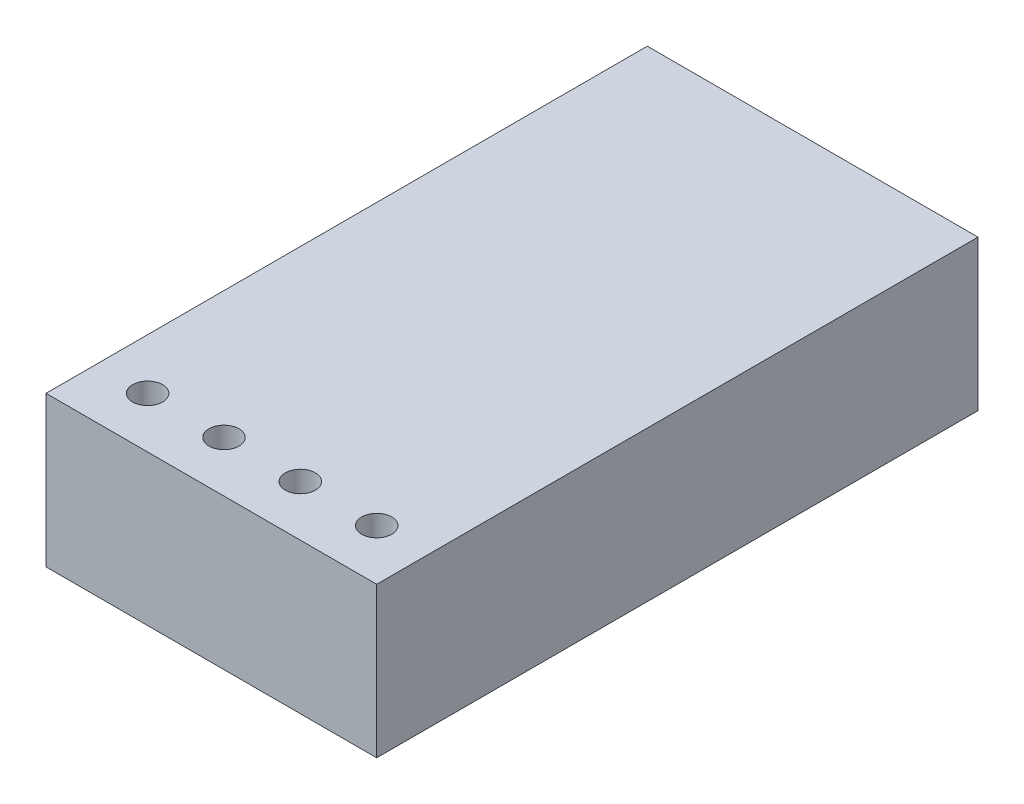
ISO-10303-21;
HEADER;
FILE_DESCRIPTION(('STEP AP214'),'2;1');
FILE_NAME('part.step','',(''),(''),'','','');
FILE_SCHEMA(('AUTOMOTIVE_DESIGN { 1 0 10303 214 1 1 1 1 }'));
ENDSEC;
DATA;
#1=APPLICATION_CONTEXT('core data for automotive mechanical design processes');
#2=APPLICATION_PROTOCOL_DEFINITION('international standard','automotive_design',2000,#1);
#3=PRODUCT_CONTEXT('',#1,'mechanical');
#4=PRODUCT('Part','Part','',(#3));
#5=PRODUCT_RELATED_PRODUCT_CATEGORY('part','',(#4));
#6=PRODUCT_DEFINITION_FORMATION('','',#4);
#7=PRODUCT_DEFINITION_CONTEXT('part definition',#1,'design');
#8=PRODUCT_DEFINITION('design','',#6,#7);
#9=PRODUCT_DEFINITION_SHAPE('','',#8);
#10=(LENGTH_UNIT() NAMED_UNIT(*) SI_UNIT(.MILLI.,.METRE.));
#11=(NAMED_UNIT(*) PLANE_ANGLE_UNIT() SI_UNIT($,.RADIAN.));
#12=(NAMED_UNIT(*) SI_UNIT($,.STERADIAN.) SOLID_ANGLE_UNIT());
#13=UNCERTAINTY_MEASURE_WITH_UNIT(LENGTH_MEASURE(1.E-05),#10,'distance_accuracy_value','');
#14=(GEOMETRIC_REPRESENTATION_CONTEXT(3) GLOBAL_UNCERTAINTY_ASSIGNED_CONTEXT((#13)) GLOBAL_UNIT_ASSIGNED_CONTEXT((#10,
#11,#12)) REPRESENTATION_CONTEXT('',''));
#15=CARTESIAN_POINT('',(0.,0.,0.));
#16=DIRECTION('',(0.,0.,1.));
#17=DIRECTION('',(1.,0.,0.));
#18=AXIS2_PLACEMENT_3D('',#15,#16,#17);
#19=CARTESIAN_POINT('',(0.,5.,0.));
#20=DIRECTION('',(0.,-1.,0.));
#21=DIRECTION('',(0.,0.,-1.));
#22=AXIS2_PLACEMENT_3D('',#19,#20,#21);
#23=PLANE('',#22);
#24=DIRECTION('',(0.,0.,1.));
#25=VECTOR('',#24,1.);
#26=CARTESIAN_POINT('',(-5.5,5.,-10.));
#27=LINE('',#26,#25);
#28=CARTESIAN_POINT('',(-5.5,5.,-10.));
#29=VERTEX_POINT('',#28);
#30=CARTESIAN_POINT('',(-5.5,5.,10.));
#31=VERTEX_POINT('',#30);
#32=EDGE_CURVE('E92',#29,#31,#27,.T.);
#33=ORIENTED_EDGE('',*,*,#32,.T.);
#34=DIRECTION('',(1.,0.,0.));
#35=VECTOR('',#34,1.);
#36=CARTESIAN_POINT('',(5.5,5.,10.));
#37=LINE('',#36,#35);
#38=CARTESIAN_POINT('',(5.5,5.,10.));
#39=VERTEX_POINT('',#38);
#40=EDGE_CURVE('E87',#31,#39,#37,.T.);
#41=ORIENTED_EDGE('',*,*,#40,.T.);
#42=DIRECTION('',(0.,0.,-1.));
#43=VECTOR('',#42,1.);
#44=CARTESIAN_POINT('',(5.5,5.,-10.));
#45=LINE('',#44,#43);
#46=CARTESIAN_POINT('',(5.5,5.,-10.));
#47=VERTEX_POINT('',#46);
#48=EDGE_CURVE('E90',#39,#47,#45,.T.);
#49=ORIENTED_EDGE('',*,*,#48,.T.);
#50=DIRECTION('',(-1.,0.,0.));
#51=VECTOR('',#50,1.);
#52=CARTESIAN_POINT('',(5.5,5.,-10.));
#53=LINE('',#52,#51);
#54=EDGE_CURVE('E57',#47,#29,#53,.T.);
#55=ORIENTED_EDGE('',*,*,#54,.T.);
#56=EDGE_LOOP('',(#33,#41,#49,#55));
#57=FACE_BOUND('',#56,.T.);
#58=CARTESIAN_POINT('',(-3.81,5.,8.31));
#59=DIRECTION('',(0.,1.,0.));
#60=DIRECTION('',(0.,0.,1.));
#61=AXIS2_PLACEMENT_3D('',#58,#59,#60);
#62=CIRCLE('',#61,0.5);
#63=CARTESIAN_POINT('',(-3.81,5.,8.81));
#64=VERTEX_POINT('',#63);
#65=EDGE_CURVE('E112',#64,#64,#62,.T.);
#66=ORIENTED_EDGE('',*,*,#65,.F.);
#67=EDGE_LOOP('',(#66));
#68=FACE_BOUND('',#67,.T.);
#69=CARTESIAN_POINT('',(-1.27,5.,8.31));
#70=DIRECTION('',(0.,1.,0.));
#71=DIRECTION('',(0.,0.,1.));
#72=AXIS2_PLACEMENT_3D('',#69,#70,#71);
#73=CIRCLE('',#72,0.500000000000001);
#74=CARTESIAN_POINT('',(-1.27,5.,8.81));
#75=VERTEX_POINT('',#74);
#76=EDGE_CURVE('E134',#75,#75,#73,.T.);
#77=ORIENTED_EDGE('',*,*,#76,.F.);
#78=EDGE_LOOP('',(#77));
#79=FACE_BOUND('',#78,.T.);
#80=CARTESIAN_POINT('',(1.27,5.,8.31));
#81=DIRECTION('',(0.,1.,0.));
#82=DIRECTION('',(0.,0.,1.));
#83=AXIS2_PLACEMENT_3D('',#80,#81,#82);
#84=CIRCLE('',#83,0.5);
#85=CARTESIAN_POINT('',(1.27,5.,8.81));
#86=VERTEX_POINT('',#85);
#87=EDGE_CURVE('E142',#86,#86,#84,.T.);
#88=ORIENTED_EDGE('',*,*,#87,.F.);
#89=EDGE_LOOP('',(#88));
#90=FACE_BOUND('',#89,.T.);
#91=CARTESIAN_POINT('',(3.81,5.,8.31));
#92=DIRECTION('',(0.,1.,0.));
#93=DIRECTION('',(0.,0.,1.));
#94=AXIS2_PLACEMENT_3D('',#91,#92,#93);
#95=CIRCLE('',#94,0.500000000000001);
#96=CARTESIAN_POINT('',(3.81,5.,8.81));
#97=VERTEX_POINT('',#96);
#98=EDGE_CURVE('E150',#97,#97,#95,.T.);
#99=ORIENTED_EDGE('',*,*,#98,.F.);
#100=EDGE_LOOP('',(#99));
#101=FACE_BOUND('',#100,.T.);
#102=ADVANCED_FACE('F39',(#57,#68,#79,#90,#101),#23,.F.);
#103=CARTESIAN_POINT('',(0.,0.,0.));
#104=DIRECTION('',(0.,-1.,0.));
#105=DIRECTION('',(0.,0.,-1.));
#106=AXIS2_PLACEMENT_3D('',#103,#104,#105);
#107=PLANE('',#106);
#108=CARTESIAN_POINT('',(1.27,0.,8.31));
#109=DIRECTION('',(0.,1.,0.));
#110=DIRECTION('',(0.,0.,1.));
#111=AXIS2_PLACEMENT_3D('',#108,#109,#110);
#112=CIRCLE('',#111,0.5);
#113=CARTESIAN_POINT('',(1.27,0.,8.81));
#114=VERTEX_POINT('',#113);
#115=EDGE_CURVE('E146',#114,#114,#112,.T.);
#116=ORIENTED_EDGE('',*,*,#115,.T.);
#117=EDGE_LOOP('',(#116));
#118=FACE_BOUND('',#117,.T.);
#119=CARTESIAN_POINT('',(-3.81,0.,8.31));
#120=DIRECTION('',(0.,1.,0.));
#121=DIRECTION('',(0.,0.,1.));
#122=AXIS2_PLACEMENT_3D('',#119,#120,#121);
#123=CIRCLE('',#122,0.5);
#124=CARTESIAN_POINT('',(-3.81,0.,8.81));
#125=VERTEX_POINT('',#124);
#126=EDGE_CURVE('E130',#125,#125,#123,.T.);
#127=ORIENTED_EDGE('',*,*,#126,.T.);
#128=EDGE_LOOP('',(#127));
#129=FACE_BOUND('',#128,.T.);
#130=DIRECTION('',(0.,0.,1.));
#131=VECTOR('',#130,1.);
#132=CARTESIAN_POINT('',(-5.5,0.,-10.));
#133=LINE('',#132,#131);
#134=CARTESIAN_POINT('',(-5.5,0.,-10.));
#135=VERTEX_POINT('',#134);
#136=CARTESIAN_POINT('',(-5.5,0.,10.));
#137=VERTEX_POINT('',#136);
#138=EDGE_CURVE('E108',#135,#137,#133,.T.);
#139=ORIENTED_EDGE('',*,*,#138,.F.);
#140=DIRECTION('',(-1.,0.,0.));
#141=VECTOR('',#140,1.);
#142=CARTESIAN_POINT('',(5.5,0.,-10.));
#143=LINE('',#142,#141);
#144=CARTESIAN_POINT('',(5.5,0.,-10.));
#145=VERTEX_POINT('',#144);
#146=EDGE_CURVE('E80',#145,#135,#143,.T.);
#147=ORIENTED_EDGE('',*,*,#146,.F.);
#148=DIRECTION('',(0.,0.,-1.));
#149=VECTOR('',#148,1.);
#150=CARTESIAN_POINT('',(5.5,0.,-10.));
#151=LINE('',#150,#149);
#152=CARTESIAN_POINT('',(5.5,0.,10.));
#153=VERTEX_POINT('',#152);
#154=EDGE_CURVE('E74',#153,#145,#151,.T.);
#155=ORIENTED_EDGE('',*,*,#154,.F.);
#156=DIRECTION('',(1.,0.,0.));
#157=VECTOR('',#156,1.);
#158=CARTESIAN_POINT('',(5.5,0.,10.));
#159=LINE('',#158,#157);
#160=EDGE_CURVE('E97',#137,#153,#159,.T.);
#161=ORIENTED_EDGE('',*,*,#160,.F.);
#162=EDGE_LOOP('',(#139,#147,#155,#161));
#163=FACE_BOUND('',#162,.T.);
#164=CARTESIAN_POINT('',(-1.27,0.,8.31));
#165=DIRECTION('',(0.,1.,0.));
#166=DIRECTION('',(0.,0.,1.));
#167=AXIS2_PLACEMENT_3D('',#164,#165,#166);
#168=CIRCLE('',#167,0.500000000000001);
#169=CARTESIAN_POINT('',(-1.27,0.,8.81));
#170=VERTEX_POINT('',#169);
#171=EDGE_CURVE('E138',#170,#170,#168,.T.);
#172=ORIENTED_EDGE('',*,*,#171,.T.);
#173=EDGE_LOOP('',(#172));
#174=FACE_BOUND('',#173,.T.);
#175=CARTESIAN_POINT('',(3.81,0.,8.31));
#176=DIRECTION('',(0.,1.,0.));
#177=DIRECTION('',(0.,0.,1.));
#178=AXIS2_PLACEMENT_3D('',#175,#176,#177);
#179=CIRCLE('',#178,0.500000000000001);
#180=CARTESIAN_POINT('',(3.81,0.,8.81));
#181=VERTEX_POINT('',#180);
#182=EDGE_CURVE('E154',#181,#181,#179,.T.);
#183=ORIENTED_EDGE('',*,*,#182,.T.);
#184=EDGE_LOOP('',(#183));
#185=FACE_BOUND('',#184,.T.);
#186=ADVANCED_FACE('F125',(#118,#129,#163,#174,#185),#107,.T.);
#187=CARTESIAN_POINT('',(-5.5,5.,-10.));
#188=DIRECTION('',(1.,0.,0.));
#189=DIRECTION('',(0.,0.,-1.));
#190=AXIS2_PLACEMENT_3D('',#187,#188,#189);
#191=PLANE('',#190);
#192=ORIENTED_EDGE('',*,*,#138,.T.);
#193=DIRECTION('',(0.,-1.,0.));
#194=VECTOR('',#193,1.);
#195=CARTESIAN_POINT('',(-5.5,5.,10.));
#196=LINE('',#195,#194);
#197=EDGE_CURVE('E11',#31,#137,#196,.T.);
#198=ORIENTED_EDGE('',*,*,#197,.F.);
#199=ORIENTED_EDGE('',*,*,#32,.F.);
#200=DIRECTION('',(0.,-1.,0.));
#201=VECTOR('',#200,1.);
#202=CARTESIAN_POINT('',(-5.5,5.,-10.));
#203=LINE('',#202,#201);
#204=EDGE_CURVE('E104',#29,#135,#203,.T.);
#205=ORIENTED_EDGE('',*,*,#204,.T.);
#206=EDGE_LOOP('',(#192,#198,#199,#205));
#207=FACE_BOUND('',#206,.T.);
#208=ADVANCED_FACE('F41',(#207),#191,.F.);
#209=CARTESIAN_POINT('',(5.5,5.,10.));
#210=DIRECTION('',(0.,0.,-1.));
#211=DIRECTION('',(-1.,0.,0.));
#212=AXIS2_PLACEMENT_3D('',#209,#210,#211);
#213=PLANE('',#212);
#214=ORIENTED_EDGE('',*,*,#160,.T.);
#215=DIRECTION('',(0.,-1.,0.));
#216=VECTOR('',#215,1.);
#217=CARTESIAN_POINT('',(5.5,5.,10.));
#218=LINE('',#217,#216);
#219=EDGE_CURVE('E49',#39,#153,#218,.T.);
#220=ORIENTED_EDGE('',*,*,#219,.F.);
#221=ORIENTED_EDGE('',*,*,#40,.F.);
#222=ORIENTED_EDGE('',*,*,#197,.T.);
#223=EDGE_LOOP('',(#214,#220,#221,#222));
#224=FACE_BOUND('',#223,.T.);
#225=ADVANCED_FACE('F96',(#224),#213,.F.);
#226=CARTESIAN_POINT('',(5.5,5.,-10.));
#227=DIRECTION('',(-1.,0.,0.));
#228=DIRECTION('',(0.,0.,1.));
#229=AXIS2_PLACEMENT_3D('',#226,#227,#228);
#230=PLANE('',#229);
#231=ORIENTED_EDGE('',*,*,#154,.T.);
#232=DIRECTION('',(0.,-1.,0.));
#233=VECTOR('',#232,1.);
#234=CARTESIAN_POINT('',(5.5,5.,-10.));
#235=LINE('',#234,#233);
#236=EDGE_CURVE('E99',#47,#145,#235,.T.);
#237=ORIENTED_EDGE('',*,*,#236,.F.);
#238=ORIENTED_EDGE('',*,*,#48,.F.);
#239=ORIENTED_EDGE('',*,*,#219,.T.);
#240=EDGE_LOOP('',(#231,#237,#238,#239));
#241=FACE_BOUND('',#240,.T.);
#242=ADVANCED_FACE('F100',(#241),#230,.F.);
#243=CARTESIAN_POINT('',(5.5,5.,-10.));
#244=DIRECTION('',(0.,0.,1.));
#245=DIRECTION('',(1.,0.,0.));
#246=AXIS2_PLACEMENT_3D('',#243,#244,#245);
#247=PLANE('',#246);
#248=ORIENTED_EDGE('',*,*,#146,.T.);
#249=ORIENTED_EDGE('',*,*,#204,.F.);
#250=ORIENTED_EDGE('',*,*,#54,.F.);
#251=ORIENTED_EDGE('',*,*,#236,.T.);
#252=EDGE_LOOP('',(#248,#249,#250,#251));
#253=FACE_BOUND('',#252,.T.);
#254=ADVANCED_FACE('F122',(#253),#247,.F.);
#255=CARTESIAN_POINT('',(-3.81,5.,8.31));
#256=DIRECTION('',(0.,-1.,0.));
#257=DIRECTION('',(0.,0.,-1.));
#258=AXIS2_PLACEMENT_3D('',#255,#256,#257);
#259=CYLINDRICAL_SURFACE('',#258,0.5);
#260=ORIENTED_EDGE('',*,*,#65,.T.);
#261=EDGE_LOOP('',(#260));
#262=FACE_BOUND('',#261,.T.);
#263=ORIENTED_EDGE('',*,*,#126,.F.);
#264=EDGE_LOOP('',(#263));
#265=FACE_BOUND('',#264,.T.);
#266=ADVANCED_FACE('F173',(#262,#265),#259,.F.);
#267=CARTESIAN_POINT('',(-1.27,5.,8.31));
#268=DIRECTION('',(0.,-1.,0.));
#269=DIRECTION('',(0.,0.,-1.));
#270=AXIS2_PLACEMENT_3D('',#267,#268,#269);
#271=CYLINDRICAL_SURFACE('',#270,0.500000000000001);
#272=ORIENTED_EDGE('',*,*,#76,.T.);
#273=EDGE_LOOP('',(#272));
#274=FACE_BOUND('',#273,.T.);
#275=ORIENTED_EDGE('',*,*,#171,.F.);
#276=EDGE_LOOP('',(#275));
#277=FACE_BOUND('',#276,.T.);
#278=ADVANCED_FACE('F219',(#274,#277),#271,.F.);
#279=CARTESIAN_POINT('',(1.27,5.,8.31));
#280=DIRECTION('',(0.,-1.,0.));
#281=DIRECTION('',(0.,0.,-1.));
#282=AXIS2_PLACEMENT_3D('',#279,#280,#281);
#283=CYLINDRICAL_SURFACE('',#282,0.5);
#284=ORIENTED_EDGE('',*,*,#87,.T.);
#285=EDGE_LOOP('',(#284));
#286=FACE_BOUND('',#285,.T.);
#287=ORIENTED_EDGE('',*,*,#115,.F.);
#288=EDGE_LOOP('',(#287));
#289=FACE_BOUND('',#288,.T.);
#290=ADVANCED_FACE('F227',(#286,#289),#283,.F.);
#291=CARTESIAN_POINT('',(3.81,5.,8.31));
#292=DIRECTION('',(0.,-1.,0.));
#293=DIRECTION('',(0.,0.,-1.));
#294=AXIS2_PLACEMENT_3D('',#291,#292,#293);
#295=CYLINDRICAL_SURFACE('',#294,0.500000000000001);
#296=ORIENTED_EDGE('',*,*,#98,.T.);
#297=EDGE_LOOP('',(#296));
#298=FACE_BOUND('',#297,.T.);
#299=ORIENTED_EDGE('',*,*,#182,.F.);
#300=EDGE_LOOP('',(#299));
#301=FACE_BOUND('',#300,.T.);
#302=ADVANCED_FACE('F162',(#298,#301),#295,.F.);
#303=CLOSED_SHELL('',(#102,#186,#208,#225,#242,#254,#266,#278,#290,#302));
#304=MANIFOLD_SOLID_BREP('B2',#303);
#305=ADVANCED_BREP_SHAPE_REPRESENTATION('',(#18,#304),#14);
#306=SHAPE_DEFINITION_REPRESENTATION(#9,#305);
ENDSEC;
END-ISO-10303-21;
